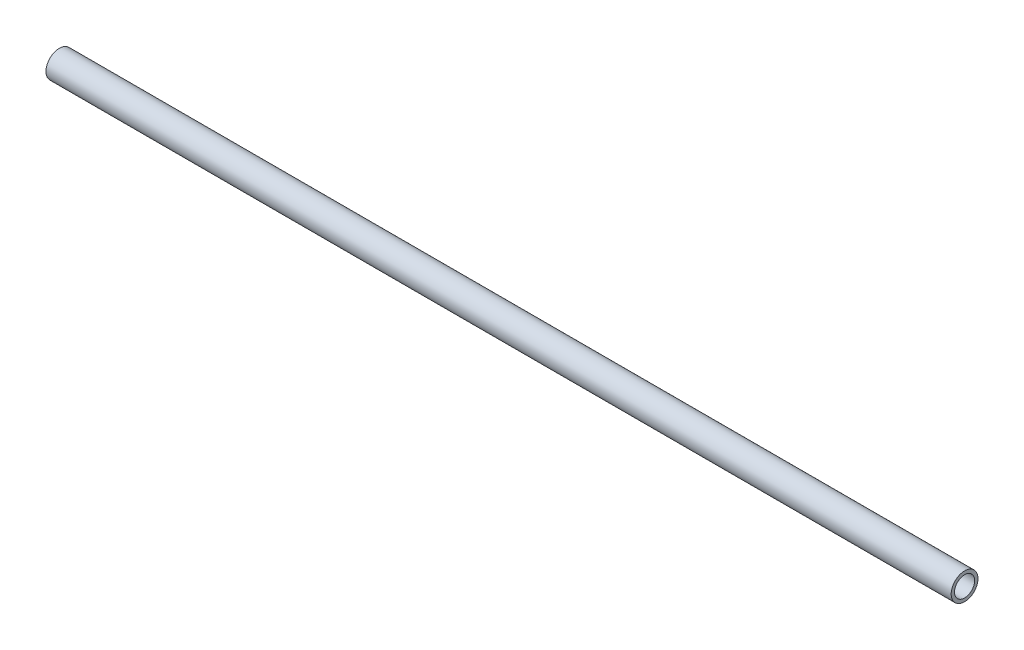
ISO-10303-21;
HEADER;
FILE_DESCRIPTION(('STEP AP214'),'2;1');
FILE_NAME('part.step','',(''),(''),'','','');
FILE_SCHEMA(('AUTOMOTIVE_DESIGN { 1 0 10303 214 1 1 1 1 }'));
ENDSEC;
DATA;
#1=APPLICATION_CONTEXT('core data for automotive mechanical design processes');
#2=APPLICATION_PROTOCOL_DEFINITION('international standard','automotive_design',2000,#1);
#3=PRODUCT_CONTEXT('',#1,'mechanical');
#4=PRODUCT('Part','Part','',(#3));
#5=PRODUCT_RELATED_PRODUCT_CATEGORY('part','',(#4));
#6=PRODUCT_DEFINITION_FORMATION('','',#4);
#7=PRODUCT_DEFINITION_CONTEXT('part definition',#1,'design');
#8=PRODUCT_DEFINITION('design','',#6,#7);
#9=PRODUCT_DEFINITION_SHAPE('','',#8);
#10=(LENGTH_UNIT() NAMED_UNIT(*) SI_UNIT(.MILLI.,.METRE.));
#11=(NAMED_UNIT(*) PLANE_ANGLE_UNIT() SI_UNIT($,.RADIAN.));
#12=(NAMED_UNIT(*) SI_UNIT($,.STERADIAN.) SOLID_ANGLE_UNIT());
#13=UNCERTAINTY_MEASURE_WITH_UNIT(LENGTH_MEASURE(1.E-05),#10,'distance_accuracy_value','');
#14=(GEOMETRIC_REPRESENTATION_CONTEXT(3) GLOBAL_UNCERTAINTY_ASSIGNED_CONTEXT((#13)) GLOBAL_UNIT_ASSIGNED_CONTEXT((#10,
#11,#12)) REPRESENTATION_CONTEXT('',''));
#15=CARTESIAN_POINT('',(0.,0.,0.));
#16=DIRECTION('',(0.,0.,1.));
#17=DIRECTION('',(1.,0.,0.));
#18=AXIS2_PLACEMENT_3D('',#15,#16,#17);
#19=CARTESIAN_POINT('',(135.,0.,0.));
#20=DIRECTION('',(1.,0.,0.));
#21=DIRECTION('',(0.,0.,-1.));
#22=AXIS2_PLACEMENT_3D('',#19,#20,#21);
#23=PLANE('',#22);
#24=CARTESIAN_POINT('',(135.,0.,0.));
#25=DIRECTION('',(1.,0.,0.));
#26=DIRECTION('',(0.,0.,-1.));
#27=AXIS2_PLACEMENT_3D('',#24,#25,#26);
#28=CIRCLE('',#27,4.);
#29=CARTESIAN_POINT('',(135.,0.,-4.));
#30=VERTEX_POINT('',#29);
#31=EDGE_CURVE('E10',#30,#30,#28,.T.);
#32=ORIENTED_EDGE('',*,*,#31,.T.);
#33=EDGE_LOOP('',(#32));
#34=FACE_BOUND('',#33,.T.);
#35=CARTESIAN_POINT('',(135.,0.,0.));
#36=DIRECTION('',(1.,0.,0.));
#37=DIRECTION('',(0.,0.,-1.));
#38=AXIS2_PLACEMENT_3D('',#35,#36,#37);
#39=CIRCLE('',#38,3.);
#40=CARTESIAN_POINT('',(135.,0.,-3.));
#41=VERTEX_POINT('',#40);
#42=EDGE_CURVE('E44',#41,#41,#39,.T.);
#43=ORIENTED_EDGE('',*,*,#42,.F.);
#44=EDGE_LOOP('',(#43));
#45=FACE_BOUND('',#44,.T.);
#46=ADVANCED_FACE('F33',(#34,#45),#23,.T.);
#47=CARTESIAN_POINT('',(-135.,0.,0.));
#48=DIRECTION('',(1.,0.,0.));
#49=DIRECTION('',(0.,0.,-1.));
#50=AXIS2_PLACEMENT_3D('',#47,#48,#49);
#51=PLANE('',#50);
#52=CARTESIAN_POINT('',(-135.,0.,0.));
#53=DIRECTION('',(1.,0.,0.));
#54=DIRECTION('',(0.,0.,-1.));
#55=AXIS2_PLACEMENT_3D('',#52,#53,#54);
#56=CIRCLE('',#55,4.);
#57=CARTESIAN_POINT('',(-135.,0.,-4.));
#58=VERTEX_POINT('',#57);
#59=EDGE_CURVE('E37',#58,#58,#56,.T.);
#60=ORIENTED_EDGE('',*,*,#59,.F.);
#61=EDGE_LOOP('',(#60));
#62=FACE_BOUND('',#61,.T.);
#63=CARTESIAN_POINT('',(-135.,0.,0.));
#64=DIRECTION('',(1.,0.,0.));
#65=DIRECTION('',(0.,0.,-1.));
#66=AXIS2_PLACEMENT_3D('',#63,#64,#65);
#67=CIRCLE('',#66,3.);
#68=CARTESIAN_POINT('',(-135.,0.,-3.));
#69=VERTEX_POINT('',#68);
#70=EDGE_CURVE('E46',#69,#69,#67,.T.);
#71=ORIENTED_EDGE('',*,*,#70,.T.);
#72=EDGE_LOOP('',(#71));
#73=FACE_BOUND('',#72,.T.);
#74=ADVANCED_FACE('F56',(#62,#73),#51,.F.);
#75=CARTESIAN_POINT('',(135.,0.,0.));
#76=DIRECTION('',(-1.,0.,0.));
#77=DIRECTION('',(0.,0.,1.));
#78=AXIS2_PLACEMENT_3D('',#75,#76,#77);
#79=CYLINDRICAL_SURFACE('',#78,4.);
#80=ORIENTED_EDGE('',*,*,#31,.F.);
#81=EDGE_LOOP('',(#80));
#82=FACE_BOUND('',#81,.T.);
#83=ORIENTED_EDGE('',*,*,#59,.T.);
#84=EDGE_LOOP('',(#83));
#85=FACE_BOUND('',#84,.T.);
#86=ADVANCED_FACE('F35',(#82,#85),#79,.T.);
#87=CARTESIAN_POINT('',(135.,0.,0.));
#88=DIRECTION('',(-1.,0.,0.));
#89=DIRECTION('',(0.,0.,1.));
#90=AXIS2_PLACEMENT_3D('',#87,#88,#89);
#91=CYLINDRICAL_SURFACE('',#90,3.);
#92=ORIENTED_EDGE('',*,*,#42,.T.);
#93=EDGE_LOOP('',(#92));
#94=FACE_BOUND('',#93,.T.);
#95=ORIENTED_EDGE('',*,*,#70,.F.);
#96=EDGE_LOOP('',(#95));
#97=FACE_BOUND('',#96,.T.);
#98=ADVANCED_FACE('F52',(#94,#97),#91,.F.);
#99=CLOSED_SHELL('',(#46,#74,#86,#98));
#100=MANIFOLD_SOLID_BREP('B2',#99);
#101=ADVANCED_BREP_SHAPE_REPRESENTATION('',(#18,#100),#14);
#102=SHAPE_DEFINITION_REPRESENTATION(#9,#101);
ENDSEC;
END-ISO-10303-21;
